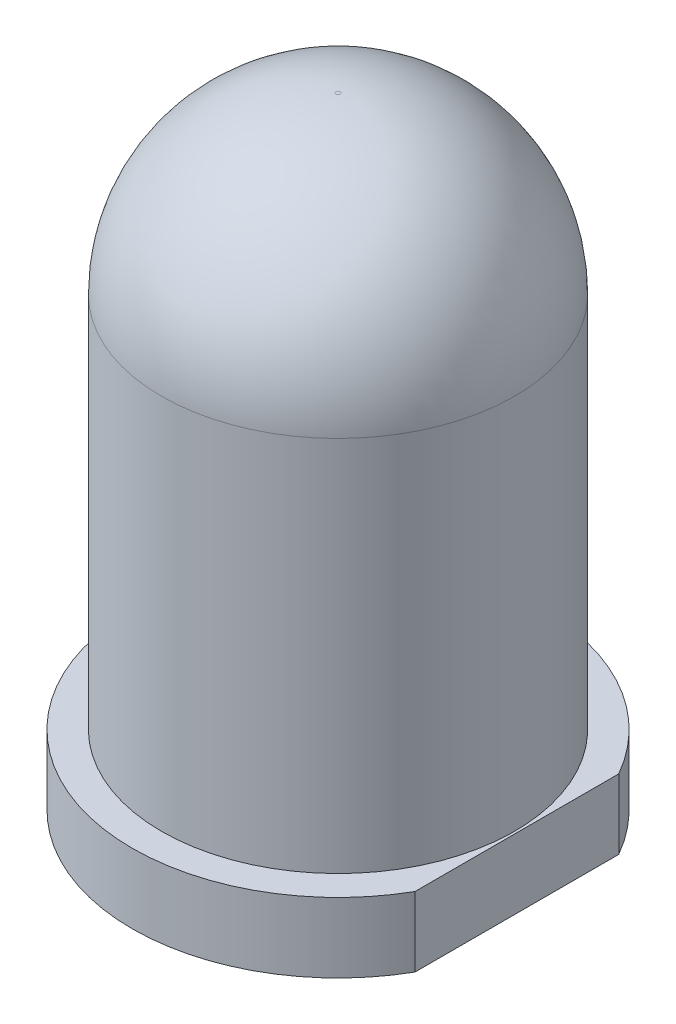
ISO-10303-21;
HEADER;
FILE_DESCRIPTION(('STEP AP214'),'2;1');
FILE_NAME('part.step','',(''),(''),'','','');
FILE_SCHEMA(('AUTOMOTIVE_DESIGN { 1 0 10303 214 1 1 1 1 }'));
ENDSEC;
DATA;
#1=APPLICATION_CONTEXT('core data for automotive mechanical design processes');
#2=APPLICATION_PROTOCOL_DEFINITION('international standard','automotive_design',2000,#1);
#3=PRODUCT_CONTEXT('',#1,'mechanical');
#4=PRODUCT('Part','Part','',(#3));
#5=PRODUCT_RELATED_PRODUCT_CATEGORY('part','',(#4));
#6=PRODUCT_DEFINITION_FORMATION('','',#4);
#7=PRODUCT_DEFINITION_CONTEXT('part definition',#1,'design');
#8=PRODUCT_DEFINITION('design','',#6,#7);
#9=PRODUCT_DEFINITION_SHAPE('','',#8);
#10=(LENGTH_UNIT() NAMED_UNIT(*) SI_UNIT(.MILLI.,.METRE.));
#11=(NAMED_UNIT(*) PLANE_ANGLE_UNIT() SI_UNIT($,.RADIAN.));
#12=(NAMED_UNIT(*) SI_UNIT($,.STERADIAN.) SOLID_ANGLE_UNIT());
#13=UNCERTAINTY_MEASURE_WITH_UNIT(LENGTH_MEASURE(1.E-05),#10,'distance_accuracy_value','');
#14=(GEOMETRIC_REPRESENTATION_CONTEXT(3) GLOBAL_UNCERTAINTY_ASSIGNED_CONTEXT((#13)) GLOBAL_UNIT_ASSIGNED_CONTEXT((#10,
#11,#12)) REPRESENTATION_CONTEXT('',''));
#15=CARTESIAN_POINT('',(0.,0.,0.));
#16=DIRECTION('',(0.,0.,1.));
#17=DIRECTION('',(1.,0.,0.));
#18=AXIS2_PLACEMENT_3D('',#15,#16,#17);
#19=CARTESIAN_POINT('',(-0.193389441025945,0.,0.));
#20=DIRECTION('',(0.,1.,0.));
#21=DIRECTION('',(0.,0.,1.));
#22=AXIS2_PLACEMENT_3D('',#19,#20,#21);
#23=PLANE('',#22);
#24=CARTESIAN_POINT('',(0.,0.,0.));
#25=DIRECTION('',(0.,1.,0.));
#26=DIRECTION('',(0.,0.,1.));
#27=AXIS2_PLACEMENT_3D('',#24,#25,#26);
#28=CIRCLE('',#27,2.95);
#29=CARTESIAN_POINT('',(2.56322111794811,0.,-1.46027309107059));
#30=VERTEX_POINT('',#29);
#31=CARTESIAN_POINT('',(2.56322111794811,0.,1.46027309107059));
#32=VERTEX_POINT('',#31);
#33=EDGE_CURVE('E20',#30,#32,#28,.T.);
#34=ORIENTED_EDGE('',*,*,#33,.F.);
#35=DIRECTION('',(0.,0.,-1.));
#36=VECTOR('',#35,1.);
#37=CARTESIAN_POINT('',(2.56322111794811,0.,1.46027309107059));
#38=LINE('',#37,#36);
#39=EDGE_CURVE('E49',#32,#30,#38,.T.);
#40=ORIENTED_EDGE('',*,*,#39,.F.);
#41=EDGE_LOOP('',(#34,#40));
#42=FACE_BOUND('',#41,.T.);
#43=ADVANCED_FACE('F16',(#42),#23,.F.);
#44=CARTESIAN_POINT('',(0.,8.9,0.));
#45=DIRECTION('',(0.,1.,0.));
#46=DIRECTION('',(0.,0.,1.));
#47=AXIS2_PLACEMENT_3D('',#44,#45,#46);
#48=PLANE('',#47);
#49=CARTESIAN_POINT('',(0.,8.9,0.));
#50=DIRECTION('',(0.,1.,0.));
#51=DIRECTION('',(0.,0.,1.));
#52=AXIS2_PLACEMENT_3D('',#49,#50,#51);
#53=CIRCLE('',#52,0.0299999999999997);
#54=CARTESIAN_POINT('',(0.,8.9,-0.03));
#55=VERTEX_POINT('',#54);
#56=CARTESIAN_POINT('',(-0.0299999999999997,8.9,0.));
#57=VERTEX_POINT('',#56);
#58=EDGE_CURVE('E62',#55,#57,#53,.T.);
#59=ORIENTED_EDGE('',*,*,#58,.T.);
#60=CARTESIAN_POINT('',(-0.03,8.9,0.));
#61=CARTESIAN_POINT('',(-0.0295413595512145,8.9,0.0200161165857815));
#62=CARTESIAN_POINT('',(-0.0110428412868562,8.9,0.0278936490318729));
#63=CARTESIAN_POINT('',(0.00635440402629913,8.9,0.0353022080563568));
#64=CARTESIAN_POINT('',(0.0212132034355964,8.9,0.0212132034355964));
#65=CARTESIAN_POINT('',(0.0349487851316746,8.9,0.00818922561247639));
#66=CARTESIAN_POINT('',(0.0278936490318729,8.9,-0.0110428412868562));
#67=CARTESIAN_POINT('',(0.021116862113243,8.9,-0.0295161375547022));
#68=CARTESIAN_POINT('',(0.,8.9,-0.03));
#69=B_SPLINE_CURVE_WITH_KNOTS('',2,(#60,#61,#62,#63,#64,#65,#66,#67,#68),.UNSPECIFIED.,.F.,.F.,
(3,2,2,2,3),(0.,0.25,0.5,0.75,1.),.UNSPECIFIED.);
#70=EDGE_CURVE('E64',#57,#55,#69,.T.);
#71=ORIENTED_EDGE('',*,*,#70,.T.);
#72=EDGE_LOOP('',(#59,#71));
#73=FACE_BOUND('',#72,.T.);
#74=ADVANCED_FACE('F69',(#73),#48,.T.);
#75=CARTESIAN_POINT('',(2.56322111794811,0.,1.46027309107059));
#76=DIRECTION('',(1.,0.,0.));
#77=DIRECTION('',(0.,0.,-1.));
#78=AXIS2_PLACEMENT_3D('',#75,#76,#77);
#79=PLANE('',#78);
#80=DIRECTION('',(0.,0.,1.));
#81=VECTOR('',#80,1.);
#82=CARTESIAN_POINT('',(2.56322111794811,1.,0.));
#83=LINE('',#82,#81);
#84=CARTESIAN_POINT('',(2.56322111794811,1.,1.46027309107059));
#85=VERTEX_POINT('',#84);
#86=CARTESIAN_POINT('',(2.56322111794811,1.,-1.46027309107059));
#87=VERTEX_POINT('',#86);
#88=EDGE_CURVE('E56',#85,#87,#83,.F.);
#89=ORIENTED_EDGE('',*,*,#88,.F.);
#90=DIRECTION('',(0.,1.,0.));
#91=VECTOR('',#90,1.);
#92=CARTESIAN_POINT('',(2.56322111794811,0.,1.46027309107059));
#93=LINE('',#92,#91);
#94=EDGE_CURVE('E53',#32,#85,#93,.T.);
#95=ORIENTED_EDGE('',*,*,#94,.F.);
#96=ORIENTED_EDGE('',*,*,#39,.T.);
#97=DIRECTION('',(0.,1.,0.));
#98=VECTOR('',#97,1.);
#99=CARTESIAN_POINT('',(2.56322111794811,0.,-1.46027309107059));
#100=LINE('',#99,#98);
#101=EDGE_CURVE('E35',#87,#30,#100,.F.);
#102=ORIENTED_EDGE('',*,*,#101,.F.);
#103=EDGE_LOOP('',(#89,#95,#96,#102));
#104=FACE_BOUND('',#103,.T.);
#105=ADVANCED_FACE('F54',(#104),#79,.T.);
#106=CARTESIAN_POINT('',(0.,0.,0.));
#107=DIRECTION('',(0.,1.,0.));
#108=DIRECTION('',(0.,0.,1.));
#109=AXIS2_PLACEMENT_3D('',#106,#107,#108);
#110=CYLINDRICAL_SURFACE('',#109,2.95);
#111=CARTESIAN_POINT('',(0.,1.,0.));
#112=DIRECTION('',(0.,1.,0.));
#113=DIRECTION('',(0.,0.,1.));
#114=AXIS2_PLACEMENT_3D('',#111,#112,#113);
#115=CIRCLE('',#114,2.95);
#116=EDGE_CURVE('E61',#87,#85,#115,.T.);
#117=ORIENTED_EDGE('',*,*,#116,.F.);
#118=ORIENTED_EDGE('',*,*,#101,.T.);
#119=ORIENTED_EDGE('',*,*,#33,.T.);
#120=ORIENTED_EDGE('',*,*,#94,.T.);
#121=EDGE_LOOP('',(#117,#118,#119,#120));
#122=FACE_BOUND('',#121,.T.);
#123=ADVANCED_FACE('F60',(#122),#110,.T.);
#124=CARTESIAN_POINT('',(0.,6.4,0.));
#125=DIRECTION('',(0.,1.,0.));
#126=DIRECTION('',(0.,0.,1.));
#127=AXIS2_PLACEMENT_3D('',#124,#125,#126);
#128=DEGENERATE_TOROIDAL_SURFACE('',#127,0.0300000000000001,2.5,.T.);
#129=CARTESIAN_POINT('',(0.,6.4,0.));
#130=DIRECTION('',(0.,1.,0.));
#131=DIRECTION('',(0.,0.,1.));
#132=AXIS2_PLACEMENT_3D('',#129,#130,#131);
#133=CIRCLE('',#132,2.53);
#134=CARTESIAN_POINT('',(0.,6.4,2.53));
#135=VERTEX_POINT('',#134);
#136=EDGE_CURVE('E26',#135,#135,#133,.F.);
#137=ORIENTED_EDGE('',*,*,#136,.F.);
#138=EDGE_LOOP('',(#137));
#139=FACE_BOUND('',#138,.T.);
#140=ORIENTED_EDGE('',*,*,#58,.F.);
#141=ORIENTED_EDGE('',*,*,#70,.F.);
#142=EDGE_LOOP('',(#140,#141));
#143=FACE_BOUND('',#142,.T.);
#144=ADVANCED_FACE('F18',(#139,#143),#128,.T.);
#145=CARTESIAN_POINT('',(-0.193389441025945,1.,0.));
#146=DIRECTION('',(0.,1.,0.));
#147=DIRECTION('',(0.,0.,1.));
#148=AXIS2_PLACEMENT_3D('',#145,#146,#147);
#149=PLANE('',#148);
#150=CARTESIAN_POINT('',(0.,1.,0.));
#151=DIRECTION('',(0.,1.,0.));
#152=DIRECTION('',(0.,0.,1.));
#153=AXIS2_PLACEMENT_3D('',#150,#151,#152);
#154=CIRCLE('',#153,2.53);
#155=CARTESIAN_POINT('',(0.,1.,2.53));
#156=VERTEX_POINT('',#155);
#157=EDGE_CURVE('E10',#156,#156,#154,.T.);
#158=ORIENTED_EDGE('',*,*,#157,.F.);
#159=EDGE_LOOP('',(#158));
#160=FACE_BOUND('',#159,.T.);
#161=ORIENTED_EDGE('',*,*,#88,.T.);
#162=ORIENTED_EDGE('',*,*,#116,.T.);
#163=EDGE_LOOP('',(#161,#162));
#164=FACE_BOUND('',#163,.T.);
#165=ADVANCED_FACE('F86',(#160,#164),#149,.T.);
#166=CARTESIAN_POINT('',(0.,0.,0.));
#167=DIRECTION('',(0.,1.,0.));
#168=DIRECTION('',(0.,0.,1.));
#169=AXIS2_PLACEMENT_3D('',#166,#167,#168);
#170=CYLINDRICAL_SURFACE('',#169,2.53);
#171=ORIENTED_EDGE('',*,*,#157,.T.);
#172=EDGE_LOOP('',(#171));
#173=FACE_BOUND('',#172,.T.);
#174=ORIENTED_EDGE('',*,*,#136,.T.);
#175=EDGE_LOOP('',(#174));
#176=FACE_BOUND('',#175,.T.);
#177=ADVANCED_FACE('F84',(#173,#176),#170,.T.);
#178=CLOSED_SHELL('',(#43,#74,#105,#123,#144,#165,#177));
#179=MANIFOLD_SOLID_BREP('B1',#178);
#180=ADVANCED_BREP_SHAPE_REPRESENTATION('',(#18,#179),#14);
#181=SHAPE_DEFINITION_REPRESENTATION(#9,#180);
ENDSEC;
END-ISO-10303-21;
